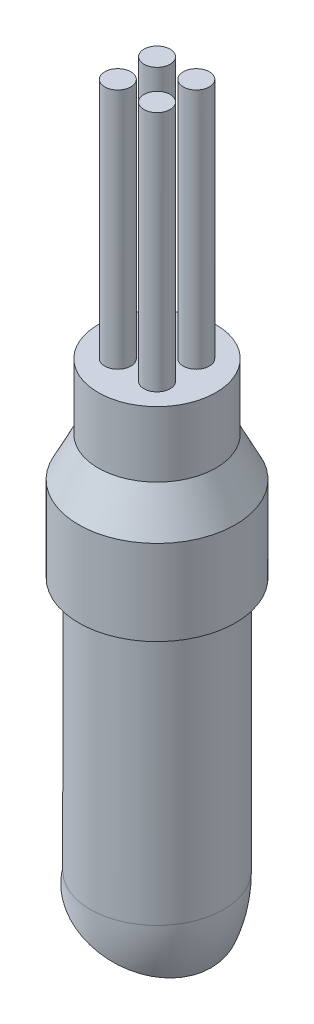
ISO-10303-21;
HEADER;
FILE_DESCRIPTION(('STEP AP214'),'2;1');
FILE_NAME('part.step','',(''),(''),'','','');
FILE_SCHEMA(('AUTOMOTIVE_DESIGN { 1 0 10303 214 1 1 1 1 }'));
ENDSEC;
DATA;
#1=APPLICATION_CONTEXT('core data for automotive mechanical design processes');
#2=APPLICATION_PROTOCOL_DEFINITION('international standard','automotive_design',2000,#1);
#3=PRODUCT_CONTEXT('',#1,'mechanical');
#4=PRODUCT('Part','Part','',(#3));
#5=PRODUCT_RELATED_PRODUCT_CATEGORY('part','',(#4));
#6=PRODUCT_DEFINITION_FORMATION('','',#4);
#7=PRODUCT_DEFINITION_CONTEXT('part definition',#1,'design');
#8=PRODUCT_DEFINITION('design','',#6,#7);
#9=PRODUCT_DEFINITION_SHAPE('','',#8);
#10=(LENGTH_UNIT() NAMED_UNIT(*) SI_UNIT(.MILLI.,.METRE.));
#11=(NAMED_UNIT(*) PLANE_ANGLE_UNIT() SI_UNIT($,.RADIAN.));
#12=(NAMED_UNIT(*) SI_UNIT($,.STERADIAN.) SOLID_ANGLE_UNIT());
#13=UNCERTAINTY_MEASURE_WITH_UNIT(LENGTH_MEASURE(1.E-05),#10,'distance_accuracy_value','');
#14=(GEOMETRIC_REPRESENTATION_CONTEXT(3) GLOBAL_UNCERTAINTY_ASSIGNED_CONTEXT((#13)) GLOBAL_UNIT_ASSIGNED_CONTEXT((#10,
#11,#12)) REPRESENTATION_CONTEXT('',''));
#15=CARTESIAN_POINT('',(0.,0.,0.));
#16=DIRECTION('',(0.,0.,1.));
#17=DIRECTION('',(1.,0.,0.));
#18=AXIS2_PLACEMENT_3D('',#15,#16,#17);
#19=CARTESIAN_POINT('',(0.,80.6492,0.));
#20=DIRECTION('',(0.,-1.,0.));
#21=DIRECTION('',(0.,0.,-1.));
#22=AXIS2_PLACEMENT_3D('',#19,#20,#21);
#23=CYLINDRICAL_SURFACE('',#22,2.55);
#24=CARTESIAN_POINT('',(0.,68.6844,0.));
#25=DIRECTION('',(0.,1.,0.));
#26=DIRECTION('',(1.,0.,0.));
#27=AXIS2_PLACEMENT_3D('',#24,#25,#26);
#28=CIRCLE('',#27,2.55);
#29=CARTESIAN_POINT('',(2.55,68.6844,0.));
#30=VERTEX_POINT('',#29);
#31=EDGE_CURVE('E64',#30,#30,#28,.T.);
#32=ORIENTED_EDGE('',*,*,#31,.T.);
#33=EDGE_LOOP('',(#32));
#34=FACE_BOUND('',#33,.T.);
#35=CARTESIAN_POINT('',(0.,78.3992,0.));
#36=DIRECTION('',(0.,1.,0.));
#37=DIRECTION('',(0.,0.,1.));
#38=AXIS2_PLACEMENT_3D('',#35,#36,#37);
#39=CIRCLE('',#38,2.55);
#40=CARTESIAN_POINT('',(0.,78.3992,2.55));
#41=VERTEX_POINT('',#40);
#42=EDGE_CURVE('E61',#41,#41,#39,.T.);
#43=ORIENTED_EDGE('',*,*,#42,.F.);
#44=EDGE_LOOP('',(#43));
#45=FACE_BOUND('',#44,.T.);
#46=ADVANCED_FACE('F14',(#34,#45),#23,.T.);
#47=CARTESIAN_POINT('',(-2.585,68.6844,0.));
#48=DIRECTION('',(0.,0.,1.));
#49=DIRECTION('',(1.,0.,0.));
#50=AXIS2_PLACEMENT_3D('',#47,#48,#49);
#51=TOROIDAL_SURFACE('',#50,2.585,2.55);
#52=CARTESIAN_POINT('',(-0.242194370510262,67.5919317934003,0.));
#53=DIRECTION('',(0.422618261740699,0.90630778703665,0.));
#54=DIRECTION('',(0.90630778703665,-0.422618261740699,0.));
#55=AXIS2_PLACEMENT_3D('',#52,#53,#54);
#56=CIRCLE('',#55,2.55);
#57=CARTESIAN_POINT('',(2.0688904864332,66.5142552259615,0.));
#58=VERTEX_POINT('',#57);
#59=EDGE_CURVE('E58',#58,#58,#56,.T.);
#60=CARTESIAN_POINT('',(-2.585,68.6844,0.));
#61=DIRECTION('',(0.,0.,1.));
#62=DIRECTION('',(1.,0.,0.));
#63=AXIS2_PLACEMENT_3D('',#60,#61,#62);
#64=CIRCLE('',#63,5.135);
#65=EDGE_CURVE('',#58,#30,#64,.T.);
#66=ORIENTED_EDGE('',*,*,#59,.T.);
#67=ORIENTED_EDGE('',*,*,#31,.F.);
#68=ORIENTED_EDGE('',*,*,#65,.T.);
#69=ORIENTED_EDGE('',*,*,#65,.F.);
#70=EDGE_LOOP('',(#66,#68,#67,#69));
#71=FACE_BOUND('',#70,.T.);
#72=ADVANCED_FACE('F70',(#71),#51,.T.);
#73=CARTESIAN_POINT('',(3.,78.3992,0.));
#74=DIRECTION('',(0.,1.,0.));
#75=DIRECTION('',(0.,0.,1.));
#76=AXIS2_PLACEMENT_3D('',#73,#74,#75);
#77=PLANE('',#76);
#78=ORIENTED_EDGE('',*,*,#42,.T.);
#79=EDGE_LOOP('',(#78));
#80=FACE_BOUND('',#79,.T.);
#81=CARTESIAN_POINT('',(0.,78.3992,0.));
#82=DIRECTION('',(0.,-1.,0.));
#83=DIRECTION('',(0.,0.,-1.));
#84=AXIS2_PLACEMENT_3D('',#81,#82,#83);
#85=CIRCLE('',#84,3.);
#86=CARTESIAN_POINT('',(0.,78.3992,-3.));
#87=VERTEX_POINT('',#86);
#88=EDGE_CURVE('E55',#87,#87,#85,.T.);
#89=ORIENTED_EDGE('',*,*,#88,.T.);
#90=EDGE_LOOP('',(#89));
#91=FACE_BOUND('',#90,.T.);
#92=ADVANCED_FACE('F72',(#80,#91),#77,.F.);
#93=CARTESIAN_POINT('',(-0.242194370510259,67.5919317934003,0.));
#94=DIRECTION('',(0.422618261740699,0.90630778703665,0.));
#95=DIRECTION('',(0.,0.,1.));
#96=AXIS2_PLACEMENT_3D('',#93,#94,#95);
#97=PLANE('',#96);
#98=ORIENTED_EDGE('',*,*,#59,.F.);
#99=EDGE_LOOP('',(#98));
#100=FACE_BOUND('',#99,.T.);
#101=ADVANCED_FACE('F80',(#100),#97,.F.);
#102=CARTESIAN_POINT('',(0.,78.3992,0.));
#103=DIRECTION('',(0.,-1.,0.));
#104=DIRECTION('',(0.,0.,-1.));
#105=AXIS2_PLACEMENT_3D('',#102,#103,#104);
#106=CYLINDRICAL_SURFACE('',#105,3.);
#107=ORIENTED_EDGE('',*,*,#88,.F.);
#108=EDGE_LOOP('',(#107));
#109=FACE_BOUND('',#108,.T.);
#110=CARTESIAN_POINT('',(0.,81.6492,0.));
#111=DIRECTION('',(0.,-1.,0.));
#112=DIRECTION('',(0.,0.,-1.));
#113=AXIS2_PLACEMENT_3D('',#110,#111,#112);
#114=CIRCLE('',#113,3.);
#115=CARTESIAN_POINT('',(0.,81.6492,-3.));
#116=VERTEX_POINT('',#115);
#117=EDGE_CURVE('E52',#116,#116,#114,.T.);
#118=ORIENTED_EDGE('',*,*,#117,.T.);
#119=EDGE_LOOP('',(#118));
#120=FACE_BOUND('',#119,.T.);
#121=ADVANCED_FACE('F87',(#109,#120),#106,.T.);
#122=CARTESIAN_POINT('',(0.,83.1492,0.));
#123=DIRECTION('',(0.,-1.,0.));
#124=DIRECTION('',(0.,0.,-1.));
#125=AXIS2_PLACEMENT_3D('',#122,#123,#124);
#126=CONICAL_SURFACE('',#125,2.25,0.463647609000806);
#127=ORIENTED_EDGE('',*,*,#117,.F.);
#128=EDGE_LOOP('',(#127));
#129=FACE_BOUND('',#128,.T.);
#130=CARTESIAN_POINT('',(0.,83.1492,0.));
#131=DIRECTION('',(0.,-1.,0.));
#132=DIRECTION('',(0.,0.,-1.));
#133=AXIS2_PLACEMENT_3D('',#130,#131,#132);
#134=CIRCLE('',#133,2.25);
#135=CARTESIAN_POINT('',(0.,83.1492,-2.25));
#136=VERTEX_POINT('',#135);
#137=EDGE_CURVE('E49',#136,#136,#134,.T.);
#138=ORIENTED_EDGE('',*,*,#137,.T.);
#139=EDGE_LOOP('',(#138));
#140=FACE_BOUND('',#139,.T.);
#141=ADVANCED_FACE('F91',(#129,#140),#126,.T.);
#142=CARTESIAN_POINT('',(0.,78.3992,0.));
#143=DIRECTION('',(0.,-1.,0.));
#144=DIRECTION('',(0.,0.,-1.));
#145=AXIS2_PLACEMENT_3D('',#142,#143,#144);
#146=CYLINDRICAL_SURFACE('',#145,2.25);
#147=ORIENTED_EDGE('',*,*,#137,.F.);
#148=EDGE_LOOP('',(#147));
#149=FACE_BOUND('',#148,.T.);
#150=CARTESIAN_POINT('',(0.,85.6492,0.));
#151=DIRECTION('',(0.,-1.,0.));
#152=DIRECTION('',(0.,0.,-1.));
#153=AXIS2_PLACEMENT_3D('',#150,#151,#152);
#154=CIRCLE('',#153,2.25);
#155=CARTESIAN_POINT('',(0.,85.6492,-2.25));
#156=VERTEX_POINT('',#155);
#157=EDGE_CURVE('E46',#156,#156,#154,.T.);
#158=ORIENTED_EDGE('',*,*,#157,.T.);
#159=EDGE_LOOP('',(#158));
#160=FACE_BOUND('',#159,.T.);
#161=ADVANCED_FACE('F95',(#149,#160),#146,.T.);
#162=CARTESIAN_POINT('',(0.,85.6492,0.));
#163=DIRECTION('',(0.,-1.,0.));
#164=DIRECTION('',(0.,0.,-1.));
#165=AXIS2_PLACEMENT_3D('',#162,#163,#164);
#166=PLANE('',#165);
#167=ORIENTED_EDGE('',*,*,#157,.F.);
#168=EDGE_LOOP('',(#167));
#169=FACE_BOUND('',#168,.T.);
#170=CARTESIAN_POINT('',(0.75,85.6492,0.75));
#171=DIRECTION('',(0.,1.,0.));
#172=DIRECTION('',(0.,0.,-1.));
#173=AXIS2_PLACEMENT_3D('',#170,#171,#172);
#174=CIRCLE('',#173,0.5);
#175=CARTESIAN_POINT('',(0.75,85.6492,0.25));
#176=VERTEX_POINT('',#175);
#177=EDGE_CURVE('E43',#176,#176,#174,.T.);
#178=ORIENTED_EDGE('',*,*,#177,.F.);
#179=EDGE_LOOP('',(#178));
#180=FACE_BOUND('',#179,.T.);
#181=CARTESIAN_POINT('',(-0.75,85.6492,0.75));
#182=DIRECTION('',(0.,1.,0.));
#183=DIRECTION('',(0.,0.,-1.));
#184=AXIS2_PLACEMENT_3D('',#181,#182,#183);
#185=CIRCLE('',#184,0.5);
#186=CARTESIAN_POINT('',(-0.75,85.6492,0.25));
#187=VERTEX_POINT('',#186);
#188=EDGE_CURVE('E40',#187,#187,#185,.T.);
#189=ORIENTED_EDGE('',*,*,#188,.F.);
#190=EDGE_LOOP('',(#189));
#191=FACE_BOUND('',#190,.T.);
#192=CARTESIAN_POINT('',(-0.75,85.6492,-0.75));
#193=DIRECTION('',(0.,1.,0.));
#194=DIRECTION('',(0.,0.,-1.));
#195=AXIS2_PLACEMENT_3D('',#192,#193,#194);
#196=CIRCLE('',#195,0.5);
#197=CARTESIAN_POINT('',(-0.75,85.6492,-1.25));
#198=VERTEX_POINT('',#197);
#199=EDGE_CURVE('E37',#198,#198,#196,.T.);
#200=ORIENTED_EDGE('',*,*,#199,.F.);
#201=EDGE_LOOP('',(#200));
#202=FACE_BOUND('',#201,.T.);
#203=CARTESIAN_POINT('',(0.75,85.6492,-0.75));
#204=DIRECTION('',(0.,1.,0.));
#205=DIRECTION('',(0.,0.,-1.));
#206=AXIS2_PLACEMENT_3D('',#203,#204,#205);
#207=CIRCLE('',#206,0.5);
#208=CARTESIAN_POINT('',(0.75,85.6492,-1.25));
#209=VERTEX_POINT('',#208);
#210=EDGE_CURVE('E34',#209,#209,#207,.T.);
#211=ORIENTED_EDGE('',*,*,#210,.F.);
#212=EDGE_LOOP('',(#211));
#213=FACE_BOUND('',#212,.T.);
#214=ADVANCED_FACE('F99',(#169,#180,#191,#202,#213),#166,.F.);
#215=CARTESIAN_POINT('',(0.75,94.895,0.75));
#216=DIRECTION('',(0.,-1.,0.));
#217=DIRECTION('',(0.,0.,-1.));
#218=AXIS2_PLACEMENT_3D('',#215,#216,#217);
#219=CYLINDRICAL_SURFACE('',#218,0.5);
#220=CARTESIAN_POINT('',(0.75,94.895,0.75));
#221=DIRECTION('',(0.,1.,0.));
#222=DIRECTION('',(1.,0.,0.));
#223=AXIS2_PLACEMENT_3D('',#220,#221,#222);
#224=CIRCLE('',#223,0.5);
#225=CARTESIAN_POINT('',(1.25,94.895,0.75));
#226=VERTEX_POINT('',#225);
#227=EDGE_CURVE('E29',#226,#226,#224,.T.);
#228=ORIENTED_EDGE('',*,*,#227,.F.);
#229=EDGE_LOOP('',(#228));
#230=FACE_BOUND('',#229,.T.);
#231=ORIENTED_EDGE('',*,*,#177,.T.);
#232=EDGE_LOOP('',(#231));
#233=FACE_BOUND('',#232,.T.);
#234=ADVANCED_FACE('F103',(#230,#233),#219,.T.);
#235=CARTESIAN_POINT('',(-0.75,94.895,0.75));
#236=DIRECTION('',(0.,-1.,0.));
#237=DIRECTION('',(0.,0.,-1.));
#238=AXIS2_PLACEMENT_3D('',#235,#236,#237);
#239=CYLINDRICAL_SURFACE('',#238,0.5);
#240=CARTESIAN_POINT('',(-0.75,94.895,0.75));
#241=DIRECTION('',(0.,1.,0.));
#242=DIRECTION('',(1.,0.,0.));
#243=AXIS2_PLACEMENT_3D('',#240,#241,#242);
#244=CIRCLE('',#243,0.5);
#245=CARTESIAN_POINT('',(-0.25,94.895,0.75));
#246=VERTEX_POINT('',#245);
#247=EDGE_CURVE('E25',#246,#246,#244,.T.);
#248=ORIENTED_EDGE('',*,*,#247,.F.);
#249=EDGE_LOOP('',(#248));
#250=FACE_BOUND('',#249,.T.);
#251=ORIENTED_EDGE('',*,*,#188,.T.);
#252=EDGE_LOOP('',(#251));
#253=FACE_BOUND('',#252,.T.);
#254=ADVANCED_FACE('F107',(#250,#253),#239,.T.);
#255=CARTESIAN_POINT('',(-0.75,94.895,-0.75));
#256=DIRECTION('',(0.,-1.,0.));
#257=DIRECTION('',(0.,0.,-1.));
#258=AXIS2_PLACEMENT_3D('',#255,#256,#257);
#259=CYLINDRICAL_SURFACE('',#258,0.5);
#260=CARTESIAN_POINT('',(-0.75,94.895,-0.75));
#261=DIRECTION('',(0.,1.,0.));
#262=DIRECTION('',(1.,0.,0.));
#263=AXIS2_PLACEMENT_3D('',#260,#261,#262);
#264=CIRCLE('',#263,0.5);
#265=CARTESIAN_POINT('',(-0.25,94.895,-0.75));
#266=VERTEX_POINT('',#265);
#267=EDGE_CURVE('E21',#266,#266,#264,.T.);
#268=ORIENTED_EDGE('',*,*,#267,.F.);
#269=EDGE_LOOP('',(#268));
#270=FACE_BOUND('',#269,.T.);
#271=ORIENTED_EDGE('',*,*,#199,.T.);
#272=EDGE_LOOP('',(#271));
#273=FACE_BOUND('',#272,.T.);
#274=ADVANCED_FACE('F111',(#270,#273),#259,.T.);
#275=CARTESIAN_POINT('',(0.75,94.895,-0.75));
#276=DIRECTION('',(0.,-1.,0.));
#277=DIRECTION('',(0.,0.,-1.));
#278=AXIS2_PLACEMENT_3D('',#275,#276,#277);
#279=CYLINDRICAL_SURFACE('',#278,0.5);
#280=CARTESIAN_POINT('',(0.75,94.895,-0.75));
#281=DIRECTION('',(0.,1.,0.));
#282=DIRECTION('',(1.,0.,0.));
#283=AXIS2_PLACEMENT_3D('',#280,#281,#282);
#284=CIRCLE('',#283,0.5);
#285=CARTESIAN_POINT('',(1.25,94.895,-0.75));
#286=VERTEX_POINT('',#285);
#287=EDGE_CURVE('E10',#286,#286,#284,.T.);
#288=ORIENTED_EDGE('',*,*,#287,.F.);
#289=EDGE_LOOP('',(#288));
#290=FACE_BOUND('',#289,.T.);
#291=ORIENTED_EDGE('',*,*,#210,.T.);
#292=EDGE_LOOP('',(#291));
#293=FACE_BOUND('',#292,.T.);
#294=ADVANCED_FACE('F115',(#290,#293),#279,.T.);
#295=CARTESIAN_POINT('',(0.75,94.895,0.75));
#296=DIRECTION('',(0.,1.,0.));
#297=DIRECTION('',(0.,0.,1.));
#298=AXIS2_PLACEMENT_3D('',#295,#296,#297);
#299=PLANE('',#298);
#300=ORIENTED_EDGE('',*,*,#227,.T.);
#301=EDGE_LOOP('',(#300));
#302=FACE_BOUND('',#301,.T.);
#303=ADVANCED_FACE('F119',(#302),#299,.T.);
#304=CARTESIAN_POINT('',(-0.75,94.895,0.75));
#305=DIRECTION('',(0.,1.,0.));
#306=DIRECTION('',(0.,0.,1.));
#307=AXIS2_PLACEMENT_3D('',#304,#305,#306);
#308=PLANE('',#307);
#309=ORIENTED_EDGE('',*,*,#247,.T.);
#310=EDGE_LOOP('',(#309));
#311=FACE_BOUND('',#310,.T.);
#312=ADVANCED_FACE('F123',(#311),#308,.T.);
#313=CARTESIAN_POINT('',(-0.75,94.895,-0.75));
#314=DIRECTION('',(0.,1.,0.));
#315=DIRECTION('',(0.,0.,1.));
#316=AXIS2_PLACEMENT_3D('',#313,#314,#315);
#317=PLANE('',#316);
#318=ORIENTED_EDGE('',*,*,#267,.T.);
#319=EDGE_LOOP('',(#318));
#320=FACE_BOUND('',#319,.T.);
#321=ADVANCED_FACE('F126',(#320),#317,.T.);
#322=CARTESIAN_POINT('',(0.75,94.895,-0.75));
#323=DIRECTION('',(0.,1.,0.));
#324=DIRECTION('',(0.,0.,1.));
#325=AXIS2_PLACEMENT_3D('',#322,#323,#324);
#326=PLANE('',#325);
#327=ORIENTED_EDGE('',*,*,#287,.T.);
#328=EDGE_LOOP('',(#327));
#329=FACE_BOUND('',#328,.T.);
#330=ADVANCED_FACE('F16',(#329),#326,.T.);
#331=CLOSED_SHELL('',(#46,#72,#92,#101,#121,#141,#161,#214,#234,#254,#274,#294,#303,#312,#321,#330));
#332=MANIFOLD_SOLID_BREP('B1',#331);
#333=ADVANCED_BREP_SHAPE_REPRESENTATION('',(#18,#332),#14);
#334=SHAPE_DEFINITION_REPRESENTATION(#9,#333);
ENDSEC;
END-ISO-10303-21;
